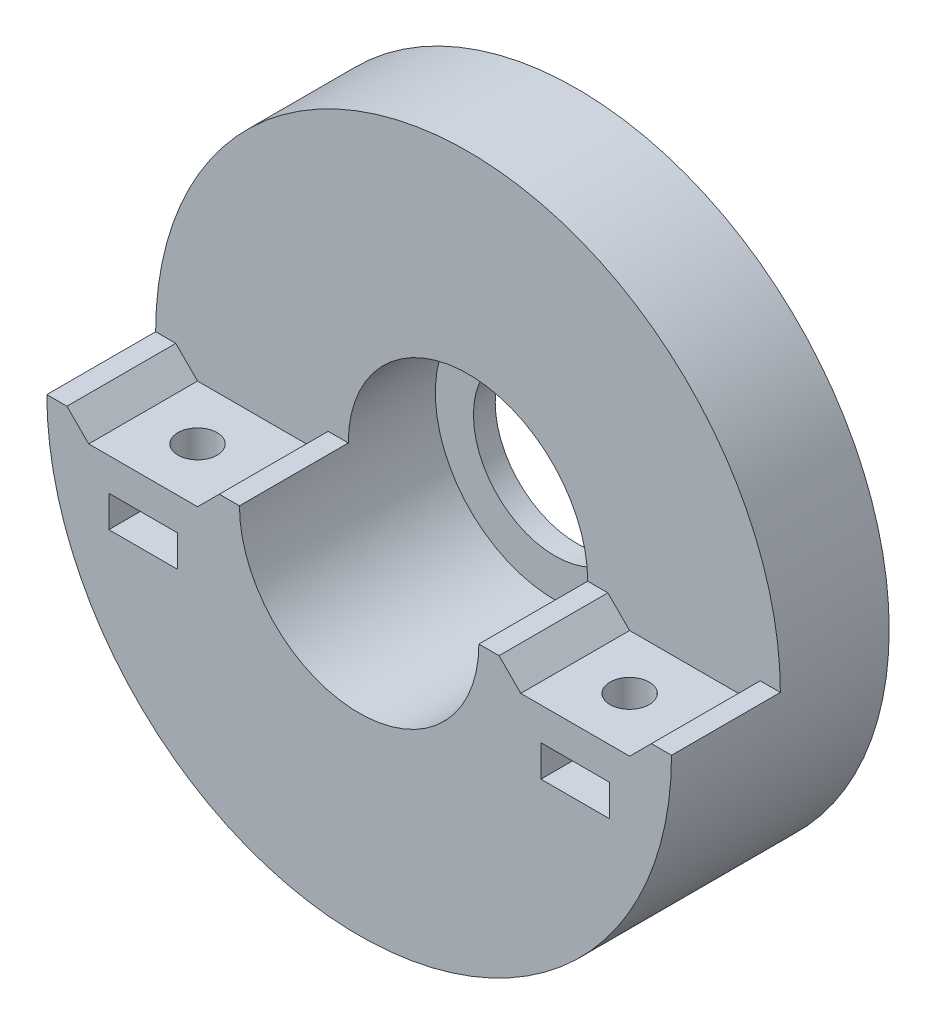
ISO-10303-21;
HEADER;
FILE_DESCRIPTION(('STEP AP214'),'2;1');
FILE_NAME('part.step','',(''),(''),'','','');
FILE_SCHEMA(('AUTOMOTIVE_DESIGN { 1 0 10303 214 1 1 1 1 }'));
ENDSEC;
DATA;
#1=APPLICATION_CONTEXT('core data for automotive mechanical design processes');
#2=APPLICATION_PROTOCOL_DEFINITION('international standard','automotive_design',2000,#1);
#3=PRODUCT_CONTEXT('',#1,'mechanical');
#4=PRODUCT('Part','Part','',(#3));
#5=PRODUCT_RELATED_PRODUCT_CATEGORY('part','',(#4));
#6=PRODUCT_DEFINITION_FORMATION('','',#4);
#7=PRODUCT_DEFINITION_CONTEXT('part definition',#1,'design');
#8=PRODUCT_DEFINITION('design','',#6,#7);
#9=PRODUCT_DEFINITION_SHAPE('','',#8);
#10=(LENGTH_UNIT() NAMED_UNIT(*) SI_UNIT(.MILLI.,.METRE.));
#11=(NAMED_UNIT(*) PLANE_ANGLE_UNIT() SI_UNIT($,.RADIAN.));
#12=(NAMED_UNIT(*) SI_UNIT($,.STERADIAN.) SOLID_ANGLE_UNIT());
#13=UNCERTAINTY_MEASURE_WITH_UNIT(LENGTH_MEASURE(1.E-05),#10,'distance_accuracy_value','');
#14=(GEOMETRIC_REPRESENTATION_CONTEXT(3) GLOBAL_UNCERTAINTY_ASSIGNED_CONTEXT((#13)) GLOBAL_UNIT_ASSIGNED_CONTEXT((#10,
#11,#12)) REPRESENTATION_CONTEXT('',''));
#15=CARTESIAN_POINT('',(0.,0.,0.));
#16=DIRECTION('',(0.,0.,1.));
#17=DIRECTION('',(1.,0.,0.));
#18=AXIS2_PLACEMENT_3D('',#15,#16,#17);
#19=CARTESIAN_POINT('',(19.85,-12.,10.));
#20=DIRECTION('',(0.,1.,0.));
#21=DIRECTION('',(-1.,0.,0.));
#22=AXIS2_PLACEMENT_3D('',#19,#20,#21);
#23=CYLINDRICAL_SURFACE('',#22,1.8);
#24=CARTESIAN_POINT('',(19.85,-1.99999999999999,10.));
#25=DIRECTION('',(0.,1.,0.));
#26=DIRECTION('',(1.,0.,0.));
#27=AXIS2_PLACEMENT_3D('',#24,#25,#26);
#28=CIRCLE('',#27,1.8);
#29=CARTESIAN_POINT('',(21.65,-1.99999999999999,10.));
#30=VERTEX_POINT('',#29);
#31=EDGE_CURVE('E291',#30,#30,#28,.T.);
#32=ORIENTED_EDGE('',*,*,#31,.T.);
#33=EDGE_LOOP('',(#32));
#34=FACE_BOUND('',#33,.T.);
#35=CARTESIAN_POINT('',(19.85,-4.99999999999999,10.));
#36=DIRECTION('',(0.,-1.,0.));
#37=DIRECTION('',(1.,0.,0.));
#38=AXIS2_PLACEMENT_3D('',#35,#36,#37);
#39=CIRCLE('',#38,1.8);
#40=CARTESIAN_POINT('',(21.65,-4.99999999999999,10.));
#41=VERTEX_POINT('',#40);
#42=EDGE_CURVE('E242',#41,#41,#39,.F.);
#43=ORIENTED_EDGE('',*,*,#42,.F.);
#44=EDGE_LOOP('',(#43));
#45=FACE_BOUND('',#44,.T.);
#46=ADVANCED_FACE('F44',(#34,#45),#23,.F.);
#47=CARTESIAN_POINT('',(-11.,0.,15.));
#48=DIRECTION('',(0.,-1.,0.));
#49=DIRECTION('',(0.,0.,-1.));
#50=AXIS2_PLACEMENT_3D('',#47,#48,#49);
#51=PLANE('',#50);
#52=DIRECTION('',(-1.,0.,0.));
#53=VECTOR('',#52,1.);
#54=CARTESIAN_POINT('',(-11.,0.,15.));
#55=LINE('',#54,#53);
#56=CARTESIAN_POINT('',(-26.85,0.,15.));
#57=VERTEX_POINT('',#56);
#58=CARTESIAN_POINT('',(-28.7,0.,15.));
#59=VERTEX_POINT('',#58);
#60=EDGE_CURVE('E326',#57,#59,#55,.T.);
#61=ORIENTED_EDGE('',*,*,#60,.F.);
#62=DIRECTION('',(0.,0.,-1.));
#63=VECTOR('',#62,1.);
#64=CARTESIAN_POINT('',(-26.85,0.,15.));
#65=LINE('',#64,#63);
#66=CARTESIAN_POINT('',(-26.85,0.,5.));
#67=VERTEX_POINT('',#66);
#68=EDGE_CURVE('E386',#57,#67,#65,.T.);
#69=ORIENTED_EDGE('',*,*,#68,.T.);
#70=DIRECTION('',(-1.,0.,0.));
#71=VECTOR('',#70,1.);
#72=CARTESIAN_POINT('',(-11.,0.,5.));
#73=LINE('',#72,#71);
#74=CARTESIAN_POINT('',(-28.7,0.,5.));
#75=VERTEX_POINT('',#74);
#76=EDGE_CURVE('E305',#67,#75,#73,.T.);
#77=ORIENTED_EDGE('',*,*,#76,.T.);
#78=DIRECTION('',(0.,0.,-1.));
#79=VECTOR('',#78,1.);
#80=CARTESIAN_POINT('',(-28.7,0.,15.));
#81=LINE('',#80,#79);
#82=EDGE_CURVE('E348',#59,#75,#81,.T.);
#83=ORIENTED_EDGE('',*,*,#82,.F.);
#84=EDGE_LOOP('',(#61,#69,#77,#83));
#85=FACE_BOUND('',#84,.T.);
#86=ADVANCED_FACE('F425',(#85),#51,.F.);
#87=CARTESIAN_POINT('',(11.,0.,15.));
#88=DIRECTION('',(0.,-1.,0.));
#89=DIRECTION('',(0.,0.,-1.));
#90=AXIS2_PLACEMENT_3D('',#87,#88,#89);
#91=PLANE('',#90);
#92=DIRECTION('',(-1.,0.,0.));
#93=VECTOR('',#92,1.);
#94=CARTESIAN_POINT('',(11.,0.,15.));
#95=LINE('',#94,#93);
#96=CARTESIAN_POINT('',(12.85,0.,15.));
#97=VERTEX_POINT('',#96);
#98=CARTESIAN_POINT('',(11.,0.,15.));
#99=VERTEX_POINT('',#98);
#100=EDGE_CURVE('E331',#97,#99,#95,.T.);
#101=ORIENTED_EDGE('',*,*,#100,.F.);
#102=DIRECTION('',(0.,0.,-1.));
#103=VECTOR('',#102,1.);
#104=CARTESIAN_POINT('',(12.85,0.,15.));
#105=LINE('',#104,#103);
#106=CARTESIAN_POINT('',(12.85,0.,5.));
#107=VERTEX_POINT('',#106);
#108=EDGE_CURVE('E381',#97,#107,#105,.T.);
#109=ORIENTED_EDGE('',*,*,#108,.T.);
#110=DIRECTION('',(-1.,0.,0.));
#111=VECTOR('',#110,1.);
#112=CARTESIAN_POINT('',(11.,0.,5.));
#113=LINE('',#112,#111);
#114=CARTESIAN_POINT('',(11.,0.,5.));
#115=VERTEX_POINT('',#114);
#116=EDGE_CURVE('E342',#107,#115,#113,.T.);
#117=ORIENTED_EDGE('',*,*,#116,.T.);
#118=DIRECTION('',(0.,0.,-1.));
#119=VECTOR('',#118,1.);
#120=CARTESIAN_POINT('',(11.,0.,15.));
#121=LINE('',#120,#119);
#122=EDGE_CURVE('E340',#99,#115,#121,.T.);
#123=ORIENTED_EDGE('',*,*,#122,.F.);
#124=EDGE_LOOP('',(#101,#109,#117,#123));
#125=FACE_BOUND('',#124,.T.);
#126=ADVANCED_FACE('F435',(#125),#91,.F.);
#127=CARTESIAN_POINT('',(0.,0.,5.));
#128=DIRECTION('',(0.,0.,-1.));
#129=DIRECTION('',(-1.,0.,0.));
#130=AXIS2_PLACEMENT_3D('',#127,#128,#129);
#131=CYLINDRICAL_SURFACE('',#130,28.7);
#132=CARTESIAN_POINT('',(0.,0.,5.));
#133=DIRECTION('',(0.,0.,1.));
#134=DIRECTION('',(1.,0.,0.));
#135=AXIS2_PLACEMENT_3D('',#132,#133,#134);
#136=CIRCLE('',#135,28.7);
#137=CARTESIAN_POINT('',(28.7,0.,5.));
#138=VERTEX_POINT('',#137);
#139=EDGE_CURVE('E366',#138,#75,#136,.T.);
#140=ORIENTED_EDGE('',*,*,#139,.F.);
#141=DIRECTION('',(0.,0.,-1.));
#142=VECTOR('',#141,1.);
#143=CARTESIAN_POINT('',(28.7,0.,15.));
#144=LINE('',#143,#142);
#145=CARTESIAN_POINT('',(28.7,0.,15.));
#146=VERTEX_POINT('',#145);
#147=EDGE_CURVE('E346',#146,#138,#144,.T.);
#148=ORIENTED_EDGE('',*,*,#147,.F.);
#149=CARTESIAN_POINT('',(0.,0.,15.));
#150=DIRECTION('',(0.,0.,1.));
#151=DIRECTION('',(1.,0.,0.));
#152=AXIS2_PLACEMENT_3D('',#149,#150,#151);
#153=CIRCLE('',#152,28.7);
#154=EDGE_CURVE('E333',#59,#146,#153,.T.);
#155=ORIENTED_EDGE('',*,*,#154,.F.);
#156=ORIENTED_EDGE('',*,*,#82,.T.);
#157=EDGE_LOOP('',(#140,#148,#155,#156));
#158=FACE_BOUND('',#157,.T.);
#159=CARTESIAN_POINT('',(0.,0.,-5.));
#160=DIRECTION('',(0.,0.,1.));
#161=DIRECTION('',(1.,0.,0.));
#162=AXIS2_PLACEMENT_3D('',#159,#160,#161);
#163=CIRCLE('',#162,28.7);
#164=CARTESIAN_POINT('',(28.7,0.,-5.));
#165=VERTEX_POINT('',#164);
#166=EDGE_CURVE('E365',#165,#165,#163,.T.);
#167=ORIENTED_EDGE('',*,*,#166,.T.);
#168=EDGE_LOOP('',(#167));
#169=FACE_BOUND('',#168,.T.);
#170=ADVANCED_FACE('F548',(#158,#169),#131,.T.);
#171=CARTESIAN_POINT('',(0.,0.,5.));
#172=DIRECTION('',(0.,0.,1.));
#173=DIRECTION('',(1.,0.,0.));
#174=AXIS2_PLACEMENT_3D('',#171,#172,#173);
#175=PLANE('',#174);
#176=CARTESIAN_POINT('',(26.85,0.,5.));
#177=VERTEX_POINT('',#176);
#178=EDGE_CURVE('E330',#138,#177,#113,.T.);
#179=ORIENTED_EDGE('',*,*,#178,.F.);
#180=ORIENTED_EDGE('',*,*,#139,.T.);
#181=ORIENTED_EDGE('',*,*,#76,.F.);
#182=DIRECTION('',(-0.70710678118655,0.707106781186545,0.));
#183=VECTOR('',#182,1.);
#184=CARTESIAN_POINT('',(-24.85,-1.99999999999999,5.));
#185=LINE('',#184,#183);
#186=CARTESIAN_POINT('',(-24.85,-2.,5.));
#187=VERTEX_POINT('',#186);
#188=EDGE_CURVE('E11',#67,#187,#185,.F.);
#189=ORIENTED_EDGE('',*,*,#188,.T.);
#190=DIRECTION('',(-1.,0.,0.));
#191=VECTOR('',#190,1.);
#192=CARTESIAN_POINT('',(-14.85,-2.,5.));
#193=LINE('',#192,#191);
#194=CARTESIAN_POINT('',(-14.85,-2.,5.));
#195=VERTEX_POINT('',#194);
#196=EDGE_CURVE('E299',#195,#187,#193,.T.);
#197=ORIENTED_EDGE('',*,*,#196,.F.);
#198=DIRECTION('',(-0.707106781186545,-0.70710678118655,0.));
#199=VECTOR('',#198,1.);
#200=CARTESIAN_POINT('',(-12.85,0.,5.));
#201=LINE('',#200,#199);
#202=CARTESIAN_POINT('',(-12.85,0.,5.));
#203=VERTEX_POINT('',#202);
#204=EDGE_CURVE('E54',#195,#203,#201,.F.);
#205=ORIENTED_EDGE('',*,*,#204,.T.);
#206=CARTESIAN_POINT('',(-11.,0.,5.));
#207=VERTEX_POINT('',#206);
#208=EDGE_CURVE('E336',#207,#203,#73,.T.);
#209=ORIENTED_EDGE('',*,*,#208,.F.);
#210=CARTESIAN_POINT('',(0.,0.,5.));
#211=DIRECTION('',(0.,0.,1.));
#212=DIRECTION('',(1.,0.,0.));
#213=AXIS2_PLACEMENT_3D('',#210,#211,#212);
#214=CIRCLE('',#213,11.);
#215=EDGE_CURVE('E361',#115,#207,#214,.T.);
#216=ORIENTED_EDGE('',*,*,#215,.F.);
#217=ORIENTED_EDGE('',*,*,#116,.F.);
#218=DIRECTION('',(-0.707106781186549,0.707106781186546,0.));
#219=VECTOR('',#218,1.);
#220=CARTESIAN_POINT('',(14.85,-1.99999999999999,5.));
#221=LINE('',#220,#219);
#222=CARTESIAN_POINT('',(14.85,-2.,5.));
#223=VERTEX_POINT('',#222);
#224=EDGE_CURVE('E392',#107,#223,#221,.F.);
#225=ORIENTED_EDGE('',*,*,#224,.T.);
#226=DIRECTION('',(-1.,0.,0.));
#227=VECTOR('',#226,1.);
#228=CARTESIAN_POINT('',(14.85,-2.,5.));
#229=LINE('',#228,#227);
#230=CARTESIAN_POINT('',(24.85,-2.,5.));
#231=VERTEX_POINT('',#230);
#232=EDGE_CURVE('E289',#231,#223,#229,.T.);
#233=ORIENTED_EDGE('',*,*,#232,.F.);
#234=DIRECTION('',(-0.707106781186545,-0.70710678118655,0.));
#235=VECTOR('',#234,1.);
#236=CARTESIAN_POINT('',(26.85,0.,5.));
#237=LINE('',#236,#235);
#238=EDGE_CURVE('E391',#231,#177,#237,.F.);
#239=ORIENTED_EDGE('',*,*,#238,.T.);
#240=EDGE_LOOP('',(#179,#180,#181,#189,#197,#205,#209,#216,#217,#225,#233,#239));
#241=FACE_BOUND('',#240,.T.);
#242=ADVANCED_FACE('F522',(#241),#175,.T.);
#243=CARTESIAN_POINT('',(0.,0.,-5.));
#244=DIRECTION('',(0.,0.,1.));
#245=DIRECTION('',(1.,0.,0.));
#246=AXIS2_PLACEMENT_3D('',#243,#244,#245);
#247=PLANE('',#246);
#248=CARTESIAN_POINT('',(0.,0.,-5.));
#249=DIRECTION('',(0.,0.,-1.));
#250=DIRECTION('',(-1.,0.,0.));
#251=AXIS2_PLACEMENT_3D('',#248,#249,#250);
#252=CIRCLE('',#251,7.5);
#253=CARTESIAN_POINT('',(-7.5,0.,-5.));
#254=VERTEX_POINT('',#253);
#255=EDGE_CURVE('E352',#254,#254,#252,.T.);
#256=ORIENTED_EDGE('',*,*,#255,.F.);
#257=EDGE_LOOP('',(#256));
#258=FACE_BOUND('',#257,.T.);
#259=ORIENTED_EDGE('',*,*,#166,.F.);
#260=EDGE_LOOP('',(#259));
#261=FACE_BOUND('',#260,.T.);
#262=ADVANCED_FACE('F552',(#258,#261),#247,.F.);
#263=CARTESIAN_POINT('',(0.,0.,-3.));
#264=DIRECTION('',(0.,0.,1.));
#265=DIRECTION('',(1.,0.,0.));
#266=AXIS2_PLACEMENT_3D('',#263,#264,#265);
#267=CYLINDRICAL_SURFACE('',#266,11.);
#268=CARTESIAN_POINT('',(0.,0.,-3.));
#269=DIRECTION('',(0.,0.,1.));
#270=DIRECTION('',(1.,0.,0.));
#271=AXIS2_PLACEMENT_3D('',#268,#269,#270);
#272=CIRCLE('',#271,11.);
#273=CARTESIAN_POINT('',(11.,0.,-3.));
#274=VERTEX_POINT('',#273);
#275=EDGE_CURVE('E360',#274,#274,#272,.T.);
#276=ORIENTED_EDGE('',*,*,#275,.F.);
#277=EDGE_LOOP('',(#276));
#278=FACE_BOUND('',#277,.T.);
#279=ORIENTED_EDGE('',*,*,#215,.T.);
#280=DIRECTION('',(0.,0.,-1.));
#281=VECTOR('',#280,1.);
#282=CARTESIAN_POINT('',(-11.,0.,15.));
#283=LINE('',#282,#281);
#284=CARTESIAN_POINT('',(-11.,0.,15.));
#285=VERTEX_POINT('',#284);
#286=EDGE_CURVE('E355',#285,#207,#283,.T.);
#287=ORIENTED_EDGE('',*,*,#286,.F.);
#288=CARTESIAN_POINT('',(0.,0.,15.));
#289=DIRECTION('',(0.,0.,-1.));
#290=DIRECTION('',(1.,0.,0.));
#291=AXIS2_PLACEMENT_3D('',#288,#289,#290);
#292=CIRCLE('',#291,11.);
#293=EDGE_CURVE('E324',#99,#285,#292,.T.);
#294=ORIENTED_EDGE('',*,*,#293,.F.);
#295=ORIENTED_EDGE('',*,*,#122,.T.);
#296=EDGE_LOOP('',(#279,#287,#294,#295));
#297=FACE_BOUND('',#296,.T.);
#298=ADVANCED_FACE('F530',(#278,#297),#267,.F.);
#299=CARTESIAN_POINT('',(0.,0.,-3.));
#300=DIRECTION('',(0.,0.,1.));
#301=DIRECTION('',(1.,0.,0.));
#302=AXIS2_PLACEMENT_3D('',#299,#300,#301);
#303=PLANE('',#302);
#304=CARTESIAN_POINT('',(0.,0.,-3.));
#305=DIRECTION('',(0.,0.,1.));
#306=DIRECTION('',(1.,0.,0.));
#307=AXIS2_PLACEMENT_3D('',#304,#305,#306);
#308=CIRCLE('',#307,7.5);
#309=CARTESIAN_POINT('',(7.5,0.,-3.));
#310=VERTEX_POINT('',#309);
#311=EDGE_CURVE('E356',#310,#310,#308,.T.);
#312=ORIENTED_EDGE('',*,*,#311,.F.);
#313=EDGE_LOOP('',(#312));
#314=FACE_BOUND('',#313,.T.);
#315=ORIENTED_EDGE('',*,*,#275,.T.);
#316=EDGE_LOOP('',(#315));
#317=FACE_BOUND('',#316,.T.);
#318=ADVANCED_FACE('F557',(#314,#317),#303,.T.);
#319=CARTESIAN_POINT('',(0.,0.,5.));
#320=DIRECTION('',(0.,0.,-1.));
#321=DIRECTION('',(-1.,0.,0.));
#322=AXIS2_PLACEMENT_3D('',#319,#320,#321);
#323=CYLINDRICAL_SURFACE('',#322,7.5);
#324=ORIENTED_EDGE('',*,*,#311,.T.);
#325=EDGE_LOOP('',(#324));
#326=FACE_BOUND('',#325,.T.);
#327=ORIENTED_EDGE('',*,*,#255,.T.);
#328=EDGE_LOOP('',(#327));
#329=FACE_BOUND('',#328,.T.);
#330=ADVANCED_FACE('F757',(#326,#329),#323,.F.);
#331=ORIENTED_EDGE('',*,*,#208,.T.);
#332=DIRECTION('',(0.,0.,1.));
#333=VECTOR('',#332,1.);
#334=CARTESIAN_POINT('',(-12.85,0.,15.));
#335=LINE('',#334,#333);
#336=CARTESIAN_POINT('',(-12.85,0.,15.));
#337=VERTEX_POINT('',#336);
#338=EDGE_CURVE('E387',#203,#337,#335,.T.);
#339=ORIENTED_EDGE('',*,*,#338,.T.);
#340=EDGE_CURVE('E327',#285,#337,#55,.T.);
#341=ORIENTED_EDGE('',*,*,#340,.F.);
#342=ORIENTED_EDGE('',*,*,#286,.T.);
#343=EDGE_LOOP('',(#331,#339,#341,#342));
#344=FACE_BOUND('',#343,.T.);
#345=ADVANCED_FACE('F434',(#344),#51,.F.);
#346=ORIENTED_EDGE('',*,*,#178,.T.);
#347=DIRECTION('',(0.,0.,1.));
#348=VECTOR('',#347,1.);
#349=CARTESIAN_POINT('',(26.85,0.,15.));
#350=LINE('',#349,#348);
#351=CARTESIAN_POINT('',(26.85,0.,15.));
#352=VERTEX_POINT('',#351);
#353=EDGE_CURVE('E367',#177,#352,#350,.T.);
#354=ORIENTED_EDGE('',*,*,#353,.T.);
#355=EDGE_CURVE('E334',#146,#352,#95,.T.);
#356=ORIENTED_EDGE('',*,*,#355,.F.);
#357=ORIENTED_EDGE('',*,*,#147,.T.);
#358=EDGE_LOOP('',(#346,#354,#356,#357));
#359=FACE_BOUND('',#358,.T.);
#360=ADVANCED_FACE('F500',(#359),#91,.F.);
#361=CARTESIAN_POINT('',(0.,0.,15.));
#362=DIRECTION('',(0.,0.,1.));
#363=DIRECTION('',(1.,0.,0.));
#364=AXIS2_PLACEMENT_3D('',#361,#362,#363);
#365=PLANE('',#364);
#366=DIRECTION('',(1.,0.,0.));
#367=VECTOR('',#366,1.);
#368=CARTESIAN_POINT('',(-16.7,-7.9,15.));
#369=LINE('',#368,#367);
#370=CARTESIAN_POINT('',(-23.,-7.9,15.));
#371=VERTEX_POINT('',#370);
#372=CARTESIAN_POINT('',(-16.7,-7.9,15.));
#373=VERTEX_POINT('',#372);
#374=EDGE_CURVE('E218',#371,#373,#369,.T.);
#375=ORIENTED_EDGE('',*,*,#374,.F.);
#376=DIRECTION('',(0.,1.,0.));
#377=VECTOR('',#376,1.);
#378=CARTESIAN_POINT('',(-23.,-7.9,15.));
#379=LINE('',#378,#377);
#380=CARTESIAN_POINT('',(-23.,-5.,15.));
#381=VERTEX_POINT('',#380);
#382=EDGE_CURVE('E209',#371,#381,#379,.T.);
#383=ORIENTED_EDGE('',*,*,#382,.T.);
#384=DIRECTION('',(1.,0.,0.));
#385=VECTOR('',#384,1.);
#386=CARTESIAN_POINT('',(-16.7,-5.,15.));
#387=LINE('',#386,#385);
#388=CARTESIAN_POINT('',(-16.7,-5.,15.));
#389=VERTEX_POINT('',#388);
#390=EDGE_CURVE('E238',#381,#389,#387,.T.);
#391=ORIENTED_EDGE('',*,*,#390,.T.);
#392=DIRECTION('',(0.,1.,0.));
#393=VECTOR('',#392,1.);
#394=CARTESIAN_POINT('',(-16.7,-7.9,15.));
#395=LINE('',#394,#393);
#396=EDGE_CURVE('E64',#373,#389,#395,.T.);
#397=ORIENTED_EDGE('',*,*,#396,.F.);
#398=EDGE_LOOP('',(#375,#383,#391,#397));
#399=FACE_BOUND('',#398,.T.);
#400=DIRECTION('',(1.,0.,0.));
#401=VECTOR('',#400,1.);
#402=CARTESIAN_POINT('',(16.7,-7.89999999999999,15.));
#403=LINE('',#402,#401);
#404=CARTESIAN_POINT('',(16.7,-7.89999999999999,15.));
#405=VERTEX_POINT('',#404);
#406=CARTESIAN_POINT('',(23.,-7.89999999999999,15.));
#407=VERTEX_POINT('',#406);
#408=EDGE_CURVE('E285',#405,#407,#403,.T.);
#409=ORIENTED_EDGE('',*,*,#408,.F.);
#410=DIRECTION('',(0.,1.,0.));
#411=VECTOR('',#410,1.);
#412=CARTESIAN_POINT('',(16.7,-7.89999999999999,15.));
#413=LINE('',#412,#411);
#414=CARTESIAN_POINT('',(16.7,-4.99999999999999,15.));
#415=VERTEX_POINT('',#414);
#416=EDGE_CURVE('E248',#405,#415,#413,.T.);
#417=ORIENTED_EDGE('',*,*,#416,.T.);
#418=DIRECTION('',(1.,0.,0.));
#419=VECTOR('',#418,1.);
#420=CARTESIAN_POINT('',(16.7,-4.99999999999999,15.));
#421=LINE('',#420,#419);
#422=CARTESIAN_POINT('',(23.,-4.99999999999999,15.));
#423=VERTEX_POINT('',#422);
#424=EDGE_CURVE('E267',#415,#423,#421,.T.);
#425=ORIENTED_EDGE('',*,*,#424,.T.);
#426=DIRECTION('',(0.,1.,0.));
#427=VECTOR('',#426,1.);
#428=CARTESIAN_POINT('',(23.,-7.89999999999999,15.));
#429=LINE('',#428,#427);
#430=EDGE_CURVE('E73',#407,#423,#429,.T.);
#431=ORIENTED_EDGE('',*,*,#430,.F.);
#432=EDGE_LOOP('',(#409,#417,#425,#431));
#433=FACE_BOUND('',#432,.T.);
#434=ORIENTED_EDGE('',*,*,#355,.T.);
#435=DIRECTION('',(0.707106781186545,0.70710678118655,0.));
#436=VECTOR('',#435,1.);
#437=CARTESIAN_POINT('',(13.4250000000001,-13.425,15.));
#438=LINE('',#437,#436);
#439=CARTESIAN_POINT('',(24.85,-2.,15.));
#440=VERTEX_POINT('',#439);
#441=EDGE_CURVE('E385',#352,#440,#438,.F.);
#442=ORIENTED_EDGE('',*,*,#441,.T.);
#443=DIRECTION('',(1.,0.,0.));
#444=VECTOR('',#443,1.);
#445=CARTESIAN_POINT('',(14.85,-2.,15.));
#446=LINE('',#445,#444);
#447=CARTESIAN_POINT('',(14.85,-2.,15.));
#448=VERTEX_POINT('',#447);
#449=EDGE_CURVE('E308',#448,#440,#446,.T.);
#450=ORIENTED_EDGE('',*,*,#449,.F.);
#451=DIRECTION('',(0.707106781186549,-0.707106781186546,0.));
#452=VECTOR('',#451,1.);
#453=CARTESIAN_POINT('',(6.42499999999998,6.42500000000001,15.));
#454=LINE('',#453,#452);
#455=EDGE_CURVE('E379',#448,#97,#454,.F.);
#456=ORIENTED_EDGE('',*,*,#455,.T.);
#457=ORIENTED_EDGE('',*,*,#100,.T.);
#458=ORIENTED_EDGE('',*,*,#293,.T.);
#459=ORIENTED_EDGE('',*,*,#340,.T.);
#460=DIRECTION('',(0.707106781186545,0.70710678118655,0.));
#461=VECTOR('',#460,1.);
#462=CARTESIAN_POINT('',(-6.42500000000005,6.425,15.));
#463=LINE('',#462,#461);
#464=CARTESIAN_POINT('',(-14.85,-2.,15.));
#465=VERTEX_POINT('',#464);
#466=EDGE_CURVE('E377',#337,#465,#463,.F.);
#467=ORIENTED_EDGE('',*,*,#466,.T.);
#468=DIRECTION('',(1.,0.,0.));
#469=VECTOR('',#468,1.);
#470=CARTESIAN_POINT('',(-14.85,-2.,15.));
#471=LINE('',#470,#469);
#472=CARTESIAN_POINT('',(-24.85,-2.,15.));
#473=VERTEX_POINT('',#472);
#474=EDGE_CURVE('E302',#473,#465,#471,.T.);
#475=ORIENTED_EDGE('',*,*,#474,.F.);
#476=DIRECTION('',(0.70710678118655,-0.707106781186545,0.));
#477=VECTOR('',#476,1.);
#478=CARTESIAN_POINT('',(-13.4249999999999,-13.425,15.));
#479=LINE('',#478,#477);
#480=EDGE_CURVE('E376',#473,#57,#479,.F.);
#481=ORIENTED_EDGE('',*,*,#480,.T.);
#482=ORIENTED_EDGE('',*,*,#60,.T.);
#483=ORIENTED_EDGE('',*,*,#154,.T.);
#484=EDGE_LOOP('',(#434,#442,#450,#456,#457,#458,#459,#467,#475,#481,#482,#483));
#485=FACE_BOUND('',#484,.T.);
#486=ADVANCED_FACE('F494',(#399,#433,#485),#365,.T.);
#487=CARTESIAN_POINT('',(14.85,-2.,-5.19803902718558));
#488=DIRECTION('',(0.,-1.,0.));
#489=DIRECTION('',(1.,0.,0.));
#490=AXIS2_PLACEMENT_3D('',#487,#488,#489);
#491=PLANE('',#490);
#492=ORIENTED_EDGE('',*,*,#31,.F.);
#493=EDGE_LOOP('',(#492));
#494=FACE_BOUND('',#493,.T.);
#495=ORIENTED_EDGE('',*,*,#232,.T.);
#496=DIRECTION('',(0.,0.,1.));
#497=VECTOR('',#496,1.);
#498=CARTESIAN_POINT('',(14.85,-2.,-5.19803902718558));
#499=LINE('',#498,#497);
#500=EDGE_CURVE('E312',#223,#448,#499,.T.);
#501=ORIENTED_EDGE('',*,*,#500,.T.);
#502=ORIENTED_EDGE('',*,*,#449,.T.);
#503=DIRECTION('',(0.,0.,1.));
#504=VECTOR('',#503,1.);
#505=CARTESIAN_POINT('',(24.85,-2.,-5.19803902718558));
#506=LINE('',#505,#504);
#507=EDGE_CURVE('E317',#231,#440,#506,.T.);
#508=ORIENTED_EDGE('',*,*,#507,.F.);
#509=EDGE_LOOP('',(#495,#501,#502,#508));
#510=FACE_BOUND('',#509,.T.);
#511=ADVANCED_FACE('F496',(#494,#510),#491,.F.);
#512=CARTESIAN_POINT('',(-14.85,-2.,-5.19803902718558));
#513=DIRECTION('',(0.,-1.,0.));
#514=DIRECTION('',(1.,0.,0.));
#515=AXIS2_PLACEMENT_3D('',#512,#513,#514);
#516=PLANE('',#515);
#517=CARTESIAN_POINT('',(-19.85,-2.,10.));
#518=DIRECTION('',(0.,1.,0.));
#519=DIRECTION('',(-1.,0.,0.));
#520=AXIS2_PLACEMENT_3D('',#517,#518,#519);
#521=CIRCLE('',#520,1.8);
#522=CARTESIAN_POINT('',(-21.65,-2.,10.));
#523=VERTEX_POINT('',#522);
#524=EDGE_CURVE('E287',#523,#523,#521,.T.);
#525=ORIENTED_EDGE('',*,*,#524,.F.);
#526=EDGE_LOOP('',(#525));
#527=FACE_BOUND('',#526,.T.);
#528=ORIENTED_EDGE('',*,*,#196,.T.);
#529=DIRECTION('',(0.,0.,1.));
#530=VECTOR('',#529,1.);
#531=CARTESIAN_POINT('',(-24.85,-2.,-5.19803902718558));
#532=LINE('',#531,#530);
#533=EDGE_CURVE('E310',#187,#473,#532,.T.);
#534=ORIENTED_EDGE('',*,*,#533,.T.);
#535=ORIENTED_EDGE('',*,*,#474,.T.);
#536=DIRECTION('',(0.,0.,1.));
#537=VECTOR('',#536,1.);
#538=CARTESIAN_POINT('',(-14.85,-2.,-5.19803902718558));
#539=LINE('',#538,#537);
#540=EDGE_CURVE('E303',#195,#465,#539,.T.);
#541=ORIENTED_EDGE('',*,*,#540,.F.);
#542=EDGE_LOOP('',(#528,#534,#535,#541));
#543=FACE_BOUND('',#542,.T.);
#544=ADVANCED_FACE('F537',(#527,#543),#516,.F.);
#545=CARTESIAN_POINT('',(26.85,0.,15.));
#546=DIRECTION('',(0.70710678118655,-0.707106781186545,0.));
#547=DIRECTION('',(0.,0.,1.));
#548=AXIS2_PLACEMENT_3D('',#545,#546,#547);
#549=PLANE('',#548);
#550=ORIENTED_EDGE('',*,*,#238,.F.);
#551=ORIENTED_EDGE('',*,*,#507,.T.);
#552=ORIENTED_EDGE('',*,*,#441,.F.);
#553=ORIENTED_EDGE('',*,*,#353,.F.);
#554=EDGE_LOOP('',(#550,#551,#552,#553));
#555=FACE_BOUND('',#554,.T.);
#556=ADVANCED_FACE('F508',(#555),#549,.F.);
#557=CARTESIAN_POINT('',(14.85,-1.99999999999999,-5.19803902718558));
#558=DIRECTION('',(-0.707106781186546,-0.707106781186549,0.));
#559=DIRECTION('',(0.,0.,1.));
#560=AXIS2_PLACEMENT_3D('',#557,#558,#559);
#561=PLANE('',#560);
#562=ORIENTED_EDGE('',*,*,#224,.F.);
#563=ORIENTED_EDGE('',*,*,#108,.F.);
#564=ORIENTED_EDGE('',*,*,#455,.F.);
#565=ORIENTED_EDGE('',*,*,#500,.F.);
#566=EDGE_LOOP('',(#562,#563,#564,#565));
#567=FACE_BOUND('',#566,.T.);
#568=ADVANCED_FACE('F521',(#567),#561,.F.);
#569=CARTESIAN_POINT('',(-12.85,0.,15.));
#570=DIRECTION('',(0.70710678118655,-0.707106781186545,0.));
#571=DIRECTION('',(0.,0.,1.));
#572=AXIS2_PLACEMENT_3D('',#569,#570,#571);
#573=PLANE('',#572);
#574=ORIENTED_EDGE('',*,*,#204,.F.);
#575=ORIENTED_EDGE('',*,*,#540,.T.);
#576=ORIENTED_EDGE('',*,*,#466,.F.);
#577=ORIENTED_EDGE('',*,*,#338,.F.);
#578=EDGE_LOOP('',(#574,#575,#576,#577));
#579=FACE_BOUND('',#578,.T.);
#580=ADVANCED_FACE('F531',(#579),#573,.F.);
#581=CARTESIAN_POINT('',(-24.85,-1.99999999999999,-5.19803902718558));
#582=DIRECTION('',(-0.707106781186545,-0.70710678118655,0.));
#583=DIRECTION('',(0.,0.,1.));
#584=AXIS2_PLACEMENT_3D('',#581,#582,#583);
#585=PLANE('',#584);
#586=ORIENTED_EDGE('',*,*,#188,.F.);
#587=ORIENTED_EDGE('',*,*,#68,.F.);
#588=ORIENTED_EDGE('',*,*,#480,.F.);
#589=ORIENTED_EDGE('',*,*,#533,.F.);
#590=EDGE_LOOP('',(#586,#587,#588,#589));
#591=FACE_BOUND('',#590,.T.);
#592=ADVANCED_FACE('F48',(#591),#585,.F.);
#593=CARTESIAN_POINT('',(-19.85,-12.,10.));
#594=DIRECTION('',(0.,1.,0.));
#595=DIRECTION('',(-1.,0.,0.));
#596=AXIS2_PLACEMENT_3D('',#593,#594,#595);
#597=CYLINDRICAL_SURFACE('',#596,1.8);
#598=CARTESIAN_POINT('',(-19.85,-5.,10.));
#599=DIRECTION('',(0.,1.,0.));
#600=DIRECTION('',(-1.,0.,0.));
#601=AXIS2_PLACEMENT_3D('',#598,#599,#600);
#602=CIRCLE('',#601,1.8);
#603=CARTESIAN_POINT('',(-21.65,-5.,10.));
#604=VERTEX_POINT('',#603);
#605=EDGE_CURVE('E397',#604,#604,#602,.F.);
#606=ORIENTED_EDGE('',*,*,#605,.T.);
#607=EDGE_LOOP('',(#606));
#608=FACE_BOUND('',#607,.T.);
#609=ORIENTED_EDGE('',*,*,#524,.T.);
#610=EDGE_LOOP('',(#609));
#611=FACE_BOUND('',#610,.T.);
#612=ADVANCED_FACE('F415',(#608,#611),#597,.F.);
#613=CARTESIAN_POINT('',(0.,-7.9,0.));
#614=DIRECTION('',(0.,-1.,0.));
#615=DIRECTION('',(1.,0.,0.));
#616=AXIS2_PLACEMENT_3D('',#613,#614,#615);
#617=PLANE('',#616);
#618=DIRECTION('',(0.,0.,1.));
#619=VECTOR('',#618,1.);
#620=CARTESIAN_POINT('',(16.7,-7.89999999999999,11.8186533479473));
#621=LINE('',#620,#619);
#622=CARTESIAN_POINT('',(16.7,-7.89999999999999,8.18134665205268));
#623=VERTEX_POINT('',#622);
#624=EDGE_CURVE('E264',#623,#405,#621,.T.);
#625=ORIENTED_EDGE('',*,*,#624,.T.);
#626=ORIENTED_EDGE('',*,*,#408,.T.);
#627=DIRECTION('',(0.,0.,-1.));
#628=VECTOR('',#627,1.);
#629=CARTESIAN_POINT('',(23.,-7.89999999999999,15.));
#630=LINE('',#629,#628);
#631=CARTESIAN_POINT('',(23.,-7.89999999999999,8.18134665205268));
#632=VERTEX_POINT('',#631);
#633=EDGE_CURVE('E278',#407,#632,#630,.T.);
#634=ORIENTED_EDGE('',*,*,#633,.T.);
#635=DIRECTION('',(-0.866025403784438,0.,-0.500000000000001));
#636=VECTOR('',#635,1.);
#637=CARTESIAN_POINT('',(19.85,-7.89999999999999,6.36269330410536));
#638=LINE('',#637,#636);
#639=CARTESIAN_POINT('',(19.85,-7.89999999999999,6.36269330410536));
#640=VERTEX_POINT('',#639);
#641=EDGE_CURVE('E280',#632,#640,#638,.T.);
#642=ORIENTED_EDGE('',*,*,#641,.T.);
#643=DIRECTION('',(-0.866025403784438,0.,0.500000000000001));
#644=VECTOR('',#643,1.);
#645=CARTESIAN_POINT('',(16.7,-7.89999999999999,8.18134665205268));
#646=LINE('',#645,#644);
#647=EDGE_CURVE('E255',#640,#623,#646,.T.);
#648=ORIENTED_EDGE('',*,*,#647,.T.);
#649=EDGE_LOOP('',(#625,#626,#634,#642,#648));
#650=FACE_BOUND('',#649,.T.);
#651=CARTESIAN_POINT('',(19.85,-7.89999999999999,10.));
#652=DIRECTION('',(0.,-1.,0.));
#653=DIRECTION('',(1.,0.,0.));
#654=AXIS2_PLACEMENT_3D('',#651,#652,#653);
#655=CIRCLE('',#654,1.8);
#656=CARTESIAN_POINT('',(21.65,-7.89999999999999,10.));
#657=VERTEX_POINT('',#656);
#658=EDGE_CURVE('E396',#657,#657,#655,.F.);
#659=ORIENTED_EDGE('',*,*,#658,.F.);
#660=EDGE_LOOP('',(#659));
#661=FACE_BOUND('',#660,.T.);
#662=ADVANCED_FACE('F422',(#650,#661),#617,.F.);
#663=CARTESIAN_POINT('',(0.,-5.,0.));
#664=DIRECTION('',(0.,-1.,0.));
#665=DIRECTION('',(1.,0.,0.));
#666=AXIS2_PLACEMENT_3D('',#663,#664,#665);
#667=PLANE('',#666);
#668=DIRECTION('',(-0.866025403784438,0.,0.500000000000001));
#669=VECTOR('',#668,1.);
#670=CARTESIAN_POINT('',(16.7,-4.99999999999999,8.18134665205268));
#671=LINE('',#670,#669);
#672=CARTESIAN_POINT('',(19.85,-4.99999999999999,6.36269330410536));
#673=VERTEX_POINT('',#672);
#674=CARTESIAN_POINT('',(16.7,-4.99999999999999,8.18134665205268));
#675=VERTEX_POINT('',#674);
#676=EDGE_CURVE('E261',#673,#675,#671,.T.);
#677=ORIENTED_EDGE('',*,*,#676,.F.);
#678=DIRECTION('',(-0.866025403784438,0.,-0.500000000000001));
#679=VECTOR('',#678,1.);
#680=CARTESIAN_POINT('',(19.85,-4.99999999999999,6.36269330410536));
#681=LINE('',#680,#679);
#682=CARTESIAN_POINT('',(23.,-4.99999999999999,8.18134665205268));
#683=VERTEX_POINT('',#682);
#684=EDGE_CURVE('E263',#683,#673,#681,.T.);
#685=ORIENTED_EDGE('',*,*,#684,.F.);
#686=DIRECTION('',(0.,0.,-1.));
#687=VECTOR('',#686,1.);
#688=CARTESIAN_POINT('',(23.,-4.99999999999999,8.18134665205268));
#689=LINE('',#688,#687);
#690=EDGE_CURVE('E266',#423,#683,#689,.T.);
#691=ORIENTED_EDGE('',*,*,#690,.F.);
#692=ORIENTED_EDGE('',*,*,#424,.F.);
#693=DIRECTION('',(0.,0.,1.));
#694=VECTOR('',#693,1.);
#695=CARTESIAN_POINT('',(16.7,-4.99999999999999,11.8186533479473));
#696=LINE('',#695,#694);
#697=EDGE_CURVE('E236',#675,#415,#696,.T.);
#698=ORIENTED_EDGE('',*,*,#697,.F.);
#699=EDGE_LOOP('',(#677,#685,#691,#692,#698));
#700=FACE_BOUND('',#699,.T.);
#701=ORIENTED_EDGE('',*,*,#42,.T.);
#702=EDGE_LOOP('',(#701));
#703=FACE_BOUND('',#702,.T.);
#704=ADVANCED_FACE('F451',(#700,#703),#667,.T.);
#705=CARTESIAN_POINT('',(16.7,-7.89999999999999,8.18134665205268));
#706=DIRECTION('',(-0.500000000000001,0.,-0.866025403784438));
#707=DIRECTION('',(-0.866025403784438,0.,0.500000000000001));
#708=AXIS2_PLACEMENT_3D('',#705,#706,#707);
#709=PLANE('',#708);
#710=ORIENTED_EDGE('',*,*,#676,.T.);
#711=DIRECTION('',(0.,1.,0.));
#712=VECTOR('',#711,1.);
#713=CARTESIAN_POINT('',(16.7,-7.89999999999999,8.18134665205268));
#714=LINE('',#713,#712);
#715=EDGE_CURVE('E259',#623,#675,#714,.T.);
#716=ORIENTED_EDGE('',*,*,#715,.F.);
#717=ORIENTED_EDGE('',*,*,#647,.F.);
#718=DIRECTION('',(0.,1.,0.));
#719=VECTOR('',#718,1.);
#720=CARTESIAN_POINT('',(19.85,-7.89999999999999,6.36269330410536));
#721=LINE('',#720,#719);
#722=EDGE_CURVE('E257',#640,#673,#721,.T.);
#723=ORIENTED_EDGE('',*,*,#722,.T.);
#724=EDGE_LOOP('',(#710,#716,#717,#723));
#725=FACE_BOUND('',#724,.T.);
#726=ADVANCED_FACE('F459',(#725),#709,.F.);
#727=CARTESIAN_POINT('',(19.85,-7.89999999999999,6.36269330410536));
#728=DIRECTION('',(0.500000000000001,0.,-0.866025403784438));
#729=DIRECTION('',(-0.866025403784438,0.,-0.500000000000001));
#730=AXIS2_PLACEMENT_3D('',#727,#728,#729);
#731=PLANE('',#730);
#732=ORIENTED_EDGE('',*,*,#684,.T.);
#733=ORIENTED_EDGE('',*,*,#722,.F.);
#734=ORIENTED_EDGE('',*,*,#641,.F.);
#735=DIRECTION('',(0.,1.,0.));
#736=VECTOR('',#735,1.);
#737=CARTESIAN_POINT('',(23.,-7.89999999999999,8.18134665205268));
#738=LINE('',#737,#736);
#739=EDGE_CURVE('E251',#632,#683,#738,.T.);
#740=ORIENTED_EDGE('',*,*,#739,.T.);
#741=EDGE_LOOP('',(#732,#733,#734,#740));
#742=FACE_BOUND('',#741,.T.);
#743=ADVANCED_FACE('F467',(#742),#731,.F.);
#744=CARTESIAN_POINT('',(23.,-7.89999999999999,8.18134665205268));
#745=DIRECTION('',(1.,0.,0.));
#746=DIRECTION('',(0.,1.,0.));
#747=AXIS2_PLACEMENT_3D('',#744,#745,#746);
#748=PLANE('',#747);
#749=ORIENTED_EDGE('',*,*,#690,.T.);
#750=ORIENTED_EDGE('',*,*,#739,.F.);
#751=ORIENTED_EDGE('',*,*,#633,.F.);
#752=ORIENTED_EDGE('',*,*,#430,.T.);
#753=EDGE_LOOP('',(#749,#750,#751,#752));
#754=FACE_BOUND('',#753,.T.);
#755=ADVANCED_FACE('F468',(#754),#748,.F.);
#756=CARTESIAN_POINT('',(16.7,-7.89999999999999,11.8186533479473));
#757=DIRECTION('',(-1.,0.,0.));
#758=DIRECTION('',(0.,-1.,0.));
#759=AXIS2_PLACEMENT_3D('',#756,#757,#758);
#760=PLANE('',#759);
#761=ORIENTED_EDGE('',*,*,#697,.T.);
#762=ORIENTED_EDGE('',*,*,#416,.F.);
#763=ORIENTED_EDGE('',*,*,#624,.F.);
#764=ORIENTED_EDGE('',*,*,#715,.T.);
#765=EDGE_LOOP('',(#761,#762,#763,#764));
#766=FACE_BOUND('',#765,.T.);
#767=ADVANCED_FACE('F450',(#766),#760,.F.);
#768=CARTESIAN_POINT('',(19.85,-12.,10.));
#769=DIRECTION('',(0.,-1.,0.));
#770=DIRECTION('',(1.,0.,0.));
#771=AXIS2_PLACEMENT_3D('',#768,#769,#770);
#772=PLANE('',#771);
#773=CARTESIAN_POINT('',(19.85,-12.,10.));
#774=DIRECTION('',(0.,1.,0.));
#775=DIRECTION('',(1.,0.,0.));
#776=AXIS2_PLACEMENT_3D('',#773,#774,#775);
#777=CIRCLE('',#776,1.8);
#778=CARTESIAN_POINT('',(21.65,-12.,10.));
#779=VERTEX_POINT('',#778);
#780=EDGE_CURVE('E298',#779,#779,#777,.T.);
#781=ORIENTED_EDGE('',*,*,#780,.T.);
#782=EDGE_LOOP('',(#781));
#783=FACE_BOUND('',#782,.T.);
#784=ADVANCED_FACE('F437',(#783),#772,.F.);
#785=ORIENTED_EDGE('',*,*,#658,.T.);
#786=EDGE_LOOP('',(#785));
#787=FACE_BOUND('',#786,.T.);
#788=ORIENTED_EDGE('',*,*,#780,.F.);
#789=EDGE_LOOP('',(#788));
#790=FACE_BOUND('',#789,.T.);
#791=ADVANCED_FACE('F428',(#787,#790),#23,.F.);
#792=CARTESIAN_POINT('',(0.,-7.9,0.));
#793=DIRECTION('',(0.,1.,0.));
#794=DIRECTION('',(-1.,0.,0.));
#795=AXIS2_PLACEMENT_3D('',#792,#793,#794);
#796=PLANE('',#795);
#797=DIRECTION('',(-0.866025403784438,0.,0.500000000000001));
#798=VECTOR('',#797,1.);
#799=CARTESIAN_POINT('',(-19.85,-7.9,6.36269330410536));
#800=LINE('',#799,#798);
#801=CARTESIAN_POINT('',(-19.85,-7.9,6.36269330410536));
#802=VERTEX_POINT('',#801);
#803=CARTESIAN_POINT('',(-23.,-7.9,8.18134665205268));
#804=VERTEX_POINT('',#803);
#805=EDGE_CURVE('E201',#802,#804,#800,.T.);
#806=ORIENTED_EDGE('',*,*,#805,.T.);
#807=DIRECTION('',(0.,0.,1.));
#808=VECTOR('',#807,1.);
#809=CARTESIAN_POINT('',(-23.,-7.9,8.18134665205268));
#810=LINE('',#809,#808);
#811=EDGE_CURVE('E214',#804,#371,#810,.T.);
#812=ORIENTED_EDGE('',*,*,#811,.T.);
#813=ORIENTED_EDGE('',*,*,#374,.T.);
#814=DIRECTION('',(0.,0.,-1.));
#815=VECTOR('',#814,1.);
#816=CARTESIAN_POINT('',(-16.7,-7.9,11.8186533479473));
#817=LINE('',#816,#815);
#818=CARTESIAN_POINT('',(-16.7,-7.9,8.18134665205268));
#819=VERTEX_POINT('',#818);
#820=EDGE_CURVE('E233',#373,#819,#817,.T.);
#821=ORIENTED_EDGE('',*,*,#820,.T.);
#822=DIRECTION('',(-0.866025403784438,0.,-0.500000000000001));
#823=VECTOR('',#822,1.);
#824=CARTESIAN_POINT('',(-16.7,-7.9,8.18134665205268));
#825=LINE('',#824,#823);
#826=EDGE_CURVE('E208',#819,#802,#825,.T.);
#827=ORIENTED_EDGE('',*,*,#826,.T.);
#828=EDGE_LOOP('',(#806,#812,#813,#821,#827));
#829=FACE_BOUND('',#828,.T.);
#830=CARTESIAN_POINT('',(-19.85,-7.9,10.));
#831=DIRECTION('',(0.,1.,0.));
#832=DIRECTION('',(-1.,0.,0.));
#833=AXIS2_PLACEMENT_3D('',#830,#831,#832);
#834=CIRCLE('',#833,1.8);
#835=CARTESIAN_POINT('',(-21.65,-7.9,10.));
#836=VERTEX_POINT('',#835);
#837=EDGE_CURVE('E49',#836,#836,#834,.F.);
#838=ORIENTED_EDGE('',*,*,#837,.T.);
#839=EDGE_LOOP('',(#838));
#840=FACE_BOUND('',#839,.T.);
#841=ADVANCED_FACE('F223',(#829,#840),#796,.T.);
#842=CARTESIAN_POINT('',(0.,-5.,0.));
#843=DIRECTION('',(0.,1.,0.));
#844=DIRECTION('',(-1.,0.,0.));
#845=AXIS2_PLACEMENT_3D('',#842,#843,#844);
#846=PLANE('',#845);
#847=DIRECTION('',(-0.866025403784438,0.,0.500000000000001));
#848=VECTOR('',#847,1.);
#849=CARTESIAN_POINT('',(-19.85,-5.,6.36269330410536));
#850=LINE('',#849,#848);
#851=CARTESIAN_POINT('',(-19.85,-5.,6.36269330410536));
#852=VERTEX_POINT('',#851);
#853=CARTESIAN_POINT('',(-23.,-5.,8.18134665205268));
#854=VERTEX_POINT('',#853);
#855=EDGE_CURVE('E207',#852,#854,#850,.T.);
#856=ORIENTED_EDGE('',*,*,#855,.F.);
#857=DIRECTION('',(-0.866025403784438,0.,-0.500000000000001));
#858=VECTOR('',#857,1.);
#859=CARTESIAN_POINT('',(-16.7,-5.,8.18134665205268));
#860=LINE('',#859,#858);
#861=CARTESIAN_POINT('',(-16.7,-5.,8.18134665205268));
#862=VERTEX_POINT('',#861);
#863=EDGE_CURVE('E224',#862,#852,#860,.T.);
#864=ORIENTED_EDGE('',*,*,#863,.F.);
#865=DIRECTION('',(0.,0.,-1.));
#866=VECTOR('',#865,1.);
#867=CARTESIAN_POINT('',(-16.7,-5.,11.8186533479473));
#868=LINE('',#867,#866);
#869=EDGE_CURVE('E227',#389,#862,#868,.T.);
#870=ORIENTED_EDGE('',*,*,#869,.F.);
#871=ORIENTED_EDGE('',*,*,#390,.F.);
#872=DIRECTION('',(0.,0.,1.));
#873=VECTOR('',#872,1.);
#874=CARTESIAN_POINT('',(-23.,-5.,15.));
#875=LINE('',#874,#873);
#876=EDGE_CURVE('E232',#854,#381,#875,.T.);
#877=ORIENTED_EDGE('',*,*,#876,.F.);
#878=EDGE_LOOP('',(#856,#864,#870,#871,#877));
#879=FACE_BOUND('',#878,.T.);
#880=ORIENTED_EDGE('',*,*,#605,.F.);
#881=EDGE_LOOP('',(#880));
#882=FACE_BOUND('',#881,.T.);
#883=ADVANCED_FACE('F444',(#879,#882),#846,.F.);
#884=CARTESIAN_POINT('',(-19.85,-7.9,6.36269330410536));
#885=DIRECTION('',(-0.500000000000001,0.,-0.866025403784438));
#886=DIRECTION('',(-0.866025403784438,0.,0.500000000000001));
#887=AXIS2_PLACEMENT_3D('',#884,#885,#886);
#888=PLANE('',#887);
#889=ORIENTED_EDGE('',*,*,#855,.T.);
#890=DIRECTION('',(0.,1.,0.));
#891=VECTOR('',#890,1.);
#892=CARTESIAN_POINT('',(-23.,-7.9,8.18134665205268));
#893=LINE('',#892,#891);
#894=EDGE_CURVE('E198',#804,#854,#893,.T.);
#895=ORIENTED_EDGE('',*,*,#894,.F.);
#896=ORIENTED_EDGE('',*,*,#805,.F.);
#897=DIRECTION('',(0.,1.,0.));
#898=VECTOR('',#897,1.);
#899=CARTESIAN_POINT('',(-19.85,-7.9,6.36269330410536));
#900=LINE('',#899,#898);
#901=EDGE_CURVE('E245',#802,#852,#900,.T.);
#902=ORIENTED_EDGE('',*,*,#901,.T.);
#903=EDGE_LOOP('',(#889,#895,#896,#902));
#904=FACE_BOUND('',#903,.T.);
#905=ADVANCED_FACE('F203',(#904),#888,.F.);
#906=CARTESIAN_POINT('',(-16.7,-7.9,8.18134665205268));
#907=DIRECTION('',(0.500000000000001,0.,-0.866025403784438));
#908=DIRECTION('',(-0.866025403784438,0.,-0.500000000000001));
#909=AXIS2_PLACEMENT_3D('',#906,#907,#908);
#910=PLANE('',#909);
#911=ORIENTED_EDGE('',*,*,#863,.T.);
#912=ORIENTED_EDGE('',*,*,#901,.F.);
#913=ORIENTED_EDGE('',*,*,#826,.F.);
#914=DIRECTION('',(0.,1.,0.));
#915=VECTOR('',#914,1.);
#916=CARTESIAN_POINT('',(-16.7,-7.9,8.18134665205268));
#917=LINE('',#916,#915);
#918=EDGE_CURVE('E244',#819,#862,#917,.T.);
#919=ORIENTED_EDGE('',*,*,#918,.T.);
#920=EDGE_LOOP('',(#911,#912,#913,#919));
#921=FACE_BOUND('',#920,.T.);
#922=ADVANCED_FACE('F477',(#921),#910,.F.);
#923=CARTESIAN_POINT('',(-16.7,-7.9,11.8186533479473));
#924=DIRECTION('',(1.,0.,0.));
#925=DIRECTION('',(0.,1.,0.));
#926=AXIS2_PLACEMENT_3D('',#923,#924,#925);
#927=PLANE('',#926);
#928=ORIENTED_EDGE('',*,*,#869,.T.);
#929=ORIENTED_EDGE('',*,*,#918,.F.);
#930=ORIENTED_EDGE('',*,*,#820,.F.);
#931=ORIENTED_EDGE('',*,*,#396,.T.);
#932=EDGE_LOOP('',(#928,#929,#930,#931));
#933=FACE_BOUND('',#932,.T.);
#934=ADVANCED_FACE('F479',(#933),#927,.F.);
#935=CARTESIAN_POINT('',(-23.,-7.9,15.));
#936=DIRECTION('',(-1.,0.,0.));
#937=DIRECTION('',(0.,-1.,0.));
#938=AXIS2_PLACEMENT_3D('',#935,#936,#937);
#939=PLANE('',#938);
#940=ORIENTED_EDGE('',*,*,#876,.T.);
#941=ORIENTED_EDGE('',*,*,#382,.F.);
#942=ORIENTED_EDGE('',*,*,#811,.F.);
#943=ORIENTED_EDGE('',*,*,#894,.T.);
#944=EDGE_LOOP('',(#940,#941,#942,#943));
#945=FACE_BOUND('',#944,.T.);
#946=ADVANCED_FACE('F211',(#945),#939,.F.);
#947=CARTESIAN_POINT('',(-19.85,-12.,10.));
#948=DIRECTION('',(0.,1.,0.));
#949=DIRECTION('',(-1.,0.,0.));
#950=AXIS2_PLACEMENT_3D('',#947,#948,#949);
#951=PLANE('',#950);
#952=CARTESIAN_POINT('',(-19.85,-12.,10.));
#953=DIRECTION('',(0.,1.,0.));
#954=DIRECTION('',(-1.,0.,0.));
#955=AXIS2_PLACEMENT_3D('',#952,#953,#954);
#956=CIRCLE('',#955,1.8);
#957=CARTESIAN_POINT('',(-21.65,-12.,10.));
#958=VERTEX_POINT('',#957);
#959=EDGE_CURVE('E288',#958,#958,#956,.T.);
#960=ORIENTED_EDGE('',*,*,#959,.T.);
#961=EDGE_LOOP('',(#960));
#962=FACE_BOUND('',#961,.T.);
#963=ADVANCED_FACE('F406',(#962),#951,.T.);
#964=ORIENTED_EDGE('',*,*,#959,.F.);
#965=EDGE_LOOP('',(#964));
#966=FACE_BOUND('',#965,.T.);
#967=ORIENTED_EDGE('',*,*,#837,.F.);
#968=EDGE_LOOP('',(#967));
#969=FACE_BOUND('',#968,.T.);
#970=ADVANCED_FACE('F410',(#966,#969),#597,.F.);
#971=CLOSED_SHELL('',(#46,#86,#126,#170,#242,#262,#298,#318,#330,#345,#360,#486,#511,#544,#556,
#568,#580,#592,#612,#662,#704,#726,#743,#755,#767,#784,#791,#841,#883,#905,#922,#934,#946,#963,#970));
#972=MANIFOLD_SOLID_BREP('B2',#971);
#973=ADVANCED_BREP_SHAPE_REPRESENTATION('',(#18,#972),#14);
#974=SHAPE_DEFINITION_REPRESENTATION(#9,#973);
ENDSEC;
END-ISO-10303-21;
